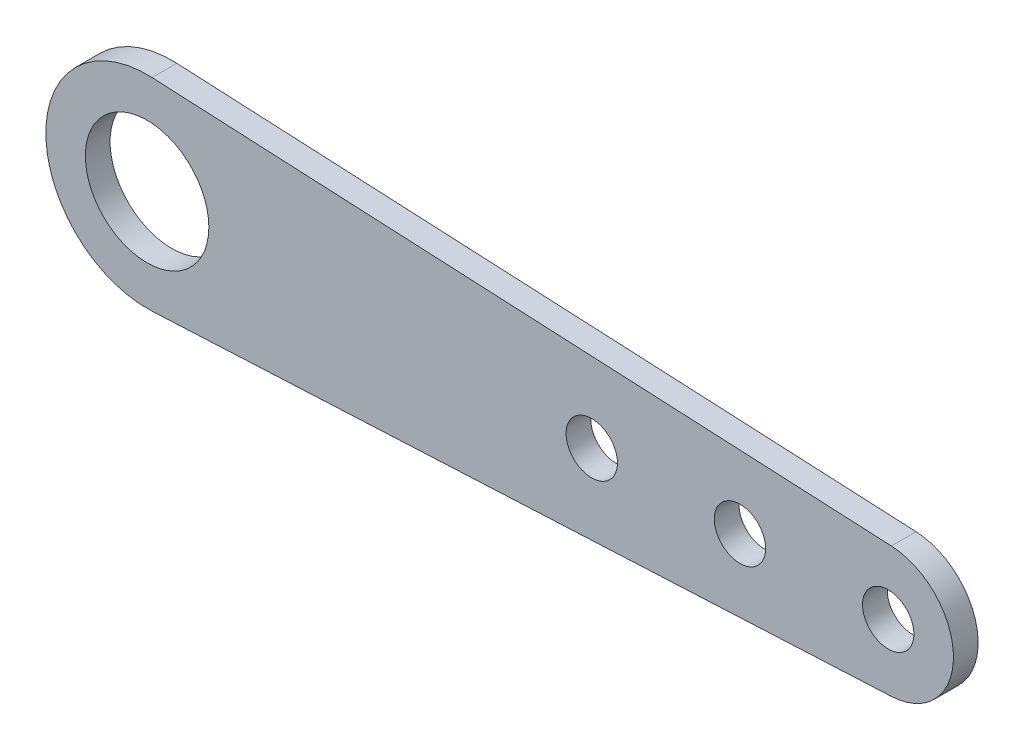
ISO-10303-21;
HEADER;
FILE_DESCRIPTION(('STEP AP214'),'2;1');
FILE_NAME('part.step','',(''),(''),'','','');
FILE_SCHEMA(('AUTOMOTIVE_DESIGN { 1 0 10303 214 1 1 1 1 }'));
ENDSEC;
DATA;
#1=APPLICATION_CONTEXT('core data for automotive mechanical design processes');
#2=APPLICATION_PROTOCOL_DEFINITION('international standard','automotive_design',2000,#1);
#3=PRODUCT_CONTEXT('',#1,'mechanical');
#4=PRODUCT('Part','Part','',(#3));
#5=PRODUCT_RELATED_PRODUCT_CATEGORY('part','',(#4));
#6=PRODUCT_DEFINITION_FORMATION('','',#4);
#7=PRODUCT_DEFINITION_CONTEXT('part definition',#1,'design');
#8=PRODUCT_DEFINITION('design','',#6,#7);
#9=PRODUCT_DEFINITION_SHAPE('','',#8);
#10=(LENGTH_UNIT() NAMED_UNIT(*) SI_UNIT(.MILLI.,.METRE.));
#11=(NAMED_UNIT(*) PLANE_ANGLE_UNIT() SI_UNIT($,.RADIAN.));
#12=(NAMED_UNIT(*) SI_UNIT($,.STERADIAN.) SOLID_ANGLE_UNIT());
#13=UNCERTAINTY_MEASURE_WITH_UNIT(LENGTH_MEASURE(1.E-05),#10,'distance_accuracy_value','');
#14=(GEOMETRIC_REPRESENTATION_CONTEXT(3) GLOBAL_UNCERTAINTY_ASSIGNED_CONTEXT((#13)) GLOBAL_UNIT_ASSIGNED_CONTEXT((#10,
#11,#12)) REPRESENTATION_CONTEXT('',''));
#15=CARTESIAN_POINT('',(0.,0.,0.));
#16=DIRECTION('',(0.,0.,1.));
#17=DIRECTION('',(1.,0.,0.));
#18=AXIS2_PLACEMENT_3D('',#15,#16,#17);
#19=CARTESIAN_POINT('',(0.,0.,3.175));
#20=DIRECTION('',(0.,0.,1.));
#21=DIRECTION('',(1.,0.,0.));
#22=AXIS2_PLACEMENT_3D('',#19,#20,#21);
#23=PLANE('',#22);
#24=CARTESIAN_POINT('',(76.2,0.,3.175));
#25=DIRECTION('',(0.,0.,1.));
#26=DIRECTION('',(1.,0.,0.));
#27=AXIS2_PLACEMENT_3D('',#24,#25,#26);
#28=CIRCLE('',#27,3.302);
#29=CARTESIAN_POINT('',(79.502,0.,3.175));
#30=VERTEX_POINT('',#29);
#31=EDGE_CURVE('E148',#30,#30,#28,.T.);
#32=ORIENTED_EDGE('',*,*,#31,.F.);
#33=EDGE_LOOP('',(#32));
#34=FACE_BOUND('',#33,.T.);
#35=CARTESIAN_POINT('',(0.,0.,3.175));
#36=DIRECTION('',(0.,0.,1.));
#37=DIRECTION('',(1.,0.,0.));
#38=AXIS2_PLACEMENT_3D('',#35,#36,#37);
#39=CIRCLE('',#38,7.9375);
#40=CARTESIAN_POINT('',(7.9375,0.,3.175));
#41=VERTEX_POINT('',#40);
#42=EDGE_CURVE('E118',#41,#41,#39,.T.);
#43=ORIENTED_EDGE('',*,*,#42,.F.);
#44=EDGE_LOOP('',(#43));
#45=FACE_BOUND('',#44,.T.);
#46=CARTESIAN_POINT('',(0.,0.,3.175));
#47=DIRECTION('',(0.,0.,1.));
#48=DIRECTION('',(1.,0.,0.));
#49=AXIS2_PLACEMENT_3D('',#46,#47,#48);
#50=CIRCLE('',#49,13.0175);
#51=CARTESIAN_POINT('',(0.633518333333333,13.0020752486413,3.175));
#52=VERTEX_POINT('',#51);
#53=CARTESIAN_POINT('',(0.633518333333333,-13.0020752486413,3.175));
#54=VERTEX_POINT('',#53);
#55=EDGE_CURVE('E98',#52,#54,#50,.T.);
#56=ORIENTED_EDGE('',*,*,#55,.T.);
#57=DIRECTION('',(0.998815075755045,0.0486666666666666,0.));
#58=VECTOR('',#57,1.);
#59=CARTESIAN_POINT('',(0.633518333333333,-13.0020752486413,3.175));
#60=LINE('',#59,#58);
#61=CARTESIAN_POINT('',(95.657924,-8.37206796497878,3.175));
#62=VERTEX_POINT('',#61);
#63=EDGE_CURVE('E93',#54,#62,#60,.T.);
#64=ORIENTED_EDGE('',*,*,#63,.T.);
#65=CARTESIAN_POINT('',(95.25,0.,3.175));
#66=DIRECTION('',(0.,0.,1.));
#67=DIRECTION('',(1.,0.,0.));
#68=AXIS2_PLACEMENT_3D('',#65,#66,#67);
#69=CIRCLE('',#68,8.382);
#70=CARTESIAN_POINT('',(95.657924,8.37206796497878,3.175));
#71=VERTEX_POINT('',#70);
#72=EDGE_CURVE('E96',#62,#71,#69,.T.);
#73=ORIENTED_EDGE('',*,*,#72,.T.);
#74=DIRECTION('',(-0.998815075755045,0.0486666666666666,0.));
#75=VECTOR('',#74,1.);
#76=CARTESIAN_POINT('',(0.633518333333333,13.0020752486413,3.175));
#77=LINE('',#76,#75);
#78=EDGE_CURVE('E63',#71,#52,#77,.T.);
#79=ORIENTED_EDGE('',*,*,#78,.T.);
#80=EDGE_LOOP('',(#56,#64,#73,#79));
#81=FACE_BOUND('',#80,.T.);
#82=CARTESIAN_POINT('',(57.15,0.,3.175));
#83=DIRECTION('',(0.,0.,1.));
#84=DIRECTION('',(1.,0.,0.));
#85=AXIS2_PLACEMENT_3D('',#82,#83,#84);
#86=CIRCLE('',#85,3.302);
#87=CARTESIAN_POINT('',(60.452,0.,3.175));
#88=VERTEX_POINT('',#87);
#89=EDGE_CURVE('E140',#88,#88,#86,.T.);
#90=ORIENTED_EDGE('',*,*,#89,.F.);
#91=EDGE_LOOP('',(#90));
#92=FACE_BOUND('',#91,.T.);
#93=CARTESIAN_POINT('',(95.25,0.,3.175));
#94=DIRECTION('',(0.,0.,1.));
#95=DIRECTION('',(1.,0.,0.));
#96=AXIS2_PLACEMENT_3D('',#93,#94,#95);
#97=CIRCLE('',#96,3.30200000000001);
#98=CARTESIAN_POINT('',(98.552,0.,3.175));
#99=VERTEX_POINT('',#98);
#100=EDGE_CURVE('E156',#99,#99,#97,.T.);
#101=ORIENTED_EDGE('',*,*,#100,.F.);
#102=EDGE_LOOP('',(#101));
#103=FACE_BOUND('',#102,.T.);
#104=ADVANCED_FACE('F45',(#34,#45,#81,#92,#103),#23,.T.);
#105=CARTESIAN_POINT('',(0.,0.,0.));
#106=DIRECTION('',(0.,0.,1.));
#107=DIRECTION('',(1.,0.,0.));
#108=AXIS2_PLACEMENT_3D('',#105,#106,#107);
#109=PLANE('',#108);
#110=CARTESIAN_POINT('',(0.,0.,0.));
#111=DIRECTION('',(0.,0.,1.));
#112=DIRECTION('',(1.,0.,0.));
#113=AXIS2_PLACEMENT_3D('',#110,#111,#112);
#114=CIRCLE('',#113,13.0175);
#115=CARTESIAN_POINT('',(0.633518333333333,13.0020752486413,0.));
#116=VERTEX_POINT('',#115);
#117=CARTESIAN_POINT('',(0.633518333333333,-13.0020752486413,0.));
#118=VERTEX_POINT('',#117);
#119=EDGE_CURVE('E114',#116,#118,#114,.T.);
#120=ORIENTED_EDGE('',*,*,#119,.F.);
#121=DIRECTION('',(-0.998815075755045,0.0486666666666666,0.));
#122=VECTOR('',#121,1.);
#123=CARTESIAN_POINT('',(0.633518333333333,13.0020752486413,0.));
#124=LINE('',#123,#122);
#125=CARTESIAN_POINT('',(95.657924,8.37206796497878,0.));
#126=VERTEX_POINT('',#125);
#127=EDGE_CURVE('E86',#126,#116,#124,.T.);
#128=ORIENTED_EDGE('',*,*,#127,.F.);
#129=CARTESIAN_POINT('',(95.25,0.,0.));
#130=DIRECTION('',(0.,0.,1.));
#131=DIRECTION('',(1.,0.,0.));
#132=AXIS2_PLACEMENT_3D('',#129,#130,#131);
#133=CIRCLE('',#132,8.382);
#134=CARTESIAN_POINT('',(95.657924,-8.37206796497878,0.));
#135=VERTEX_POINT('',#134);
#136=EDGE_CURVE('E80',#135,#126,#133,.T.);
#137=ORIENTED_EDGE('',*,*,#136,.F.);
#138=DIRECTION('',(0.998815075755045,0.0486666666666666,0.));
#139=VECTOR('',#138,1.);
#140=CARTESIAN_POINT('',(0.633518333333333,-13.0020752486413,0.));
#141=LINE('',#140,#139);
#142=EDGE_CURVE('E103',#118,#135,#141,.T.);
#143=ORIENTED_EDGE('',*,*,#142,.F.);
#144=EDGE_LOOP('',(#120,#128,#137,#143));
#145=FACE_BOUND('',#144,.T.);
#146=CARTESIAN_POINT('',(0.,0.,0.));
#147=DIRECTION('',(0.,0.,1.));
#148=DIRECTION('',(1.,0.,0.));
#149=AXIS2_PLACEMENT_3D('',#146,#147,#148);
#150=CIRCLE('',#149,7.9375);
#151=CARTESIAN_POINT('',(7.9375,0.,0.));
#152=VERTEX_POINT('',#151);
#153=EDGE_CURVE('E136',#152,#152,#150,.T.);
#154=ORIENTED_EDGE('',*,*,#153,.T.);
#155=EDGE_LOOP('',(#154));
#156=FACE_BOUND('',#155,.T.);
#157=CARTESIAN_POINT('',(57.15,0.,0.));
#158=DIRECTION('',(0.,0.,1.));
#159=DIRECTION('',(1.,0.,0.));
#160=AXIS2_PLACEMENT_3D('',#157,#158,#159);
#161=CIRCLE('',#160,3.302);
#162=CARTESIAN_POINT('',(60.452,0.,0.));
#163=VERTEX_POINT('',#162);
#164=EDGE_CURVE('E144',#163,#163,#161,.T.);
#165=ORIENTED_EDGE('',*,*,#164,.T.);
#166=EDGE_LOOP('',(#165));
#167=FACE_BOUND('',#166,.T.);
#168=CARTESIAN_POINT('',(76.2,0.,0.));
#169=DIRECTION('',(0.,0.,1.));
#170=DIRECTION('',(1.,0.,0.));
#171=AXIS2_PLACEMENT_3D('',#168,#169,#170);
#172=CIRCLE('',#171,3.302);
#173=CARTESIAN_POINT('',(79.502,0.,0.));
#174=VERTEX_POINT('',#173);
#175=EDGE_CURVE('E152',#174,#174,#172,.T.);
#176=ORIENTED_EDGE('',*,*,#175,.T.);
#177=EDGE_LOOP('',(#176));
#178=FACE_BOUND('',#177,.T.);
#179=CARTESIAN_POINT('',(95.25,0.,0.));
#180=DIRECTION('',(0.,0.,1.));
#181=DIRECTION('',(1.,0.,0.));
#182=AXIS2_PLACEMENT_3D('',#179,#180,#181);
#183=CIRCLE('',#182,3.30200000000001);
#184=CARTESIAN_POINT('',(98.552,0.,0.));
#185=VERTEX_POINT('',#184);
#186=EDGE_CURVE('E160',#185,#185,#183,.T.);
#187=ORIENTED_EDGE('',*,*,#186,.T.);
#188=EDGE_LOOP('',(#187));
#189=FACE_BOUND('',#188,.T.);
#190=ADVANCED_FACE('F131',(#145,#156,#167,#178,#189),#109,.F.);
#191=CARTESIAN_POINT('',(0.,0.,3.175));
#192=DIRECTION('',(0.,0.,-1.));
#193=DIRECTION('',(-1.,0.,0.));
#194=AXIS2_PLACEMENT_3D('',#191,#192,#193);
#195=CYLINDRICAL_SURFACE('',#194,13.0175);
#196=ORIENTED_EDGE('',*,*,#119,.T.);
#197=DIRECTION('',(0.,0.,-1.));
#198=VECTOR('',#197,1.);
#199=CARTESIAN_POINT('',(0.633518333333333,-13.0020752486413,3.175));
#200=LINE('',#199,#198);
#201=EDGE_CURVE('E11',#54,#118,#200,.T.);
#202=ORIENTED_EDGE('',*,*,#201,.F.);
#203=ORIENTED_EDGE('',*,*,#55,.F.);
#204=DIRECTION('',(0.,0.,-1.));
#205=VECTOR('',#204,1.);
#206=CARTESIAN_POINT('',(0.633518333333333,13.0020752486413,3.175));
#207=LINE('',#206,#205);
#208=EDGE_CURVE('E110',#52,#116,#207,.T.);
#209=ORIENTED_EDGE('',*,*,#208,.T.);
#210=EDGE_LOOP('',(#196,#202,#203,#209));
#211=FACE_BOUND('',#210,.T.);
#212=ADVANCED_FACE('F47',(#211),#195,.T.);
#213=CARTESIAN_POINT('',(0.633518333333333,-13.0020752486413,3.175));
#214=DIRECTION('',(-0.0486666666666666,0.998815075755045,0.));
#215=DIRECTION('',(-0.998815075755045,-0.0486666666666666,0.));
#216=AXIS2_PLACEMENT_3D('',#213,#214,#215);
#217=PLANE('',#216);
#218=ORIENTED_EDGE('',*,*,#142,.T.);
#219=DIRECTION('',(0.,0.,-1.));
#220=VECTOR('',#219,1.);
#221=CARTESIAN_POINT('',(95.657924,-8.37206796497878,3.175));
#222=LINE('',#221,#220);
#223=EDGE_CURVE('E55',#62,#135,#222,.T.);
#224=ORIENTED_EDGE('',*,*,#223,.F.);
#225=ORIENTED_EDGE('',*,*,#63,.F.);
#226=ORIENTED_EDGE('',*,*,#201,.T.);
#227=EDGE_LOOP('',(#218,#224,#225,#226));
#228=FACE_BOUND('',#227,.T.);
#229=ADVANCED_FACE('F102',(#228),#217,.F.);
#230=CARTESIAN_POINT('',(95.25,0.,3.175));
#231=DIRECTION('',(0.,0.,-1.));
#232=DIRECTION('',(-1.,0.,0.));
#233=AXIS2_PLACEMENT_3D('',#230,#231,#232);
#234=CYLINDRICAL_SURFACE('',#233,8.382);
#235=ORIENTED_EDGE('',*,*,#136,.T.);
#236=DIRECTION('',(0.,0.,-1.));
#237=VECTOR('',#236,1.);
#238=CARTESIAN_POINT('',(95.657924,8.37206796497878,3.175));
#239=LINE('',#238,#237);
#240=EDGE_CURVE('E105',#71,#126,#239,.T.);
#241=ORIENTED_EDGE('',*,*,#240,.F.);
#242=ORIENTED_EDGE('',*,*,#72,.F.);
#243=ORIENTED_EDGE('',*,*,#223,.T.);
#244=EDGE_LOOP('',(#235,#241,#242,#243));
#245=FACE_BOUND('',#244,.T.);
#246=ADVANCED_FACE('F106',(#245),#234,.T.);
#247=CARTESIAN_POINT('',(0.633518333333333,13.0020752486413,3.175));
#248=DIRECTION('',(-0.0486666666666666,-0.998815075755045,0.));
#249=DIRECTION('',(0.998815075755045,-0.0486666666666666,0.));
#250=AXIS2_PLACEMENT_3D('',#247,#248,#249);
#251=PLANE('',#250);
#252=ORIENTED_EDGE('',*,*,#127,.T.);
#253=ORIENTED_EDGE('',*,*,#208,.F.);
#254=ORIENTED_EDGE('',*,*,#78,.F.);
#255=ORIENTED_EDGE('',*,*,#240,.T.);
#256=EDGE_LOOP('',(#252,#253,#254,#255));
#257=FACE_BOUND('',#256,.T.);
#258=ADVANCED_FACE('F128',(#257),#251,.F.);
#259=CARTESIAN_POINT('',(0.,0.,3.175));
#260=DIRECTION('',(0.,0.,-1.));
#261=DIRECTION('',(-1.,0.,0.));
#262=AXIS2_PLACEMENT_3D('',#259,#260,#261);
#263=CYLINDRICAL_SURFACE('',#262,7.9375);
#264=ORIENTED_EDGE('',*,*,#42,.T.);
#265=EDGE_LOOP('',(#264));
#266=FACE_BOUND('',#265,.T.);
#267=ORIENTED_EDGE('',*,*,#153,.F.);
#268=EDGE_LOOP('',(#267));
#269=FACE_BOUND('',#268,.T.);
#270=ADVANCED_FACE('F181',(#266,#269),#263,.F.);
#271=CARTESIAN_POINT('',(57.15,0.,3.175));
#272=DIRECTION('',(0.,0.,-1.));
#273=DIRECTION('',(-1.,0.,0.));
#274=AXIS2_PLACEMENT_3D('',#271,#272,#273);
#275=CYLINDRICAL_SURFACE('',#274,3.302);
#276=ORIENTED_EDGE('',*,*,#89,.T.);
#277=EDGE_LOOP('',(#276));
#278=FACE_BOUND('',#277,.T.);
#279=ORIENTED_EDGE('',*,*,#164,.F.);
#280=EDGE_LOOP('',(#279));
#281=FACE_BOUND('',#280,.T.);
#282=ADVANCED_FACE('F226',(#278,#281),#275,.F.);
#283=CARTESIAN_POINT('',(76.2,0.,3.175));
#284=DIRECTION('',(0.,0.,-1.));
#285=DIRECTION('',(-1.,0.,0.));
#286=AXIS2_PLACEMENT_3D('',#283,#284,#285);
#287=CYLINDRICAL_SURFACE('',#286,3.302);
#288=ORIENTED_EDGE('',*,*,#31,.T.);
#289=EDGE_LOOP('',(#288));
#290=FACE_BOUND('',#289,.T.);
#291=ORIENTED_EDGE('',*,*,#175,.F.);
#292=EDGE_LOOP('',(#291));
#293=FACE_BOUND('',#292,.T.);
#294=ADVANCED_FACE('F234',(#290,#293),#287,.F.);
#295=CARTESIAN_POINT('',(95.25,0.,3.175));
#296=DIRECTION('',(0.,0.,-1.));
#297=DIRECTION('',(-1.,0.,0.));
#298=AXIS2_PLACEMENT_3D('',#295,#296,#297);
#299=CYLINDRICAL_SURFACE('',#298,3.30200000000001);
#300=ORIENTED_EDGE('',*,*,#100,.T.);
#301=EDGE_LOOP('',(#300));
#302=FACE_BOUND('',#301,.T.);
#303=ORIENTED_EDGE('',*,*,#186,.F.);
#304=EDGE_LOOP('',(#303));
#305=FACE_BOUND('',#304,.T.);
#306=ADVANCED_FACE('F168',(#302,#305),#299,.F.);
#307=CLOSED_SHELL('',(#104,#190,#212,#229,#246,#258,#270,#282,#294,#306));
#308=MANIFOLD_SOLID_BREP('B2',#307);
#309=ADVANCED_BREP_SHAPE_REPRESENTATION('',(#18,#308),#14);
#310=SHAPE_DEFINITION_REPRESENTATION(#9,#309);
ENDSEC;
END-ISO-10303-21;
